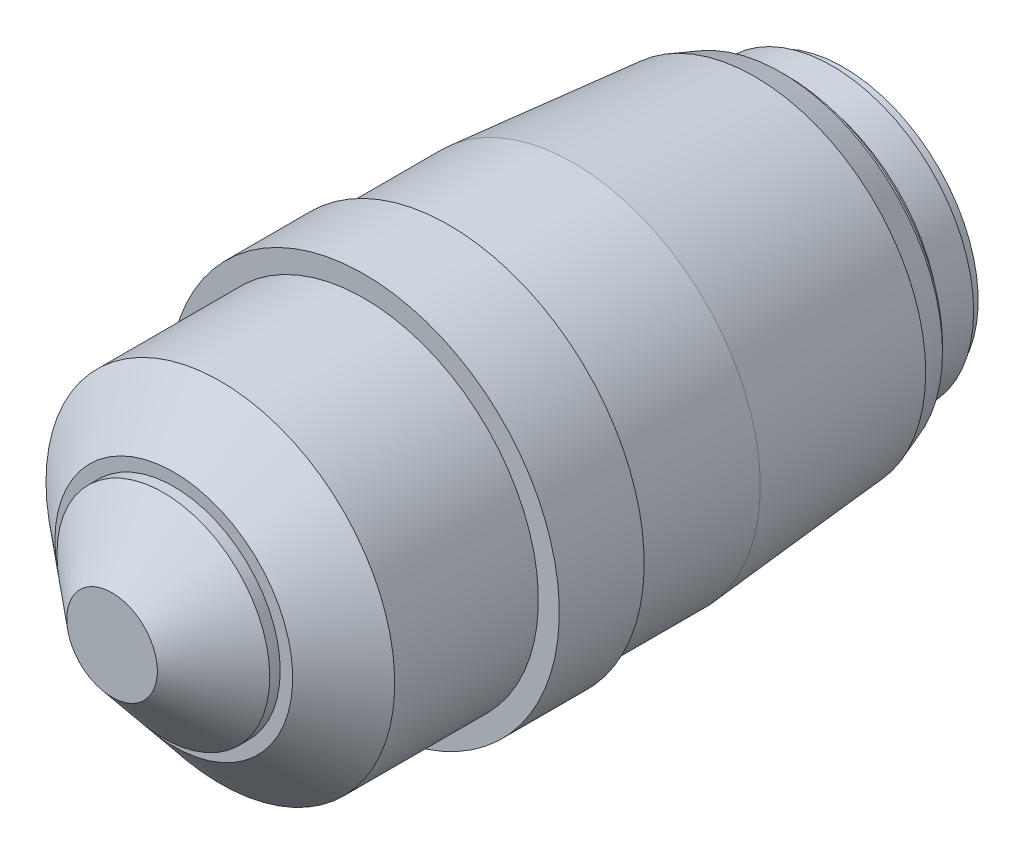
ISO-10303-21;
HEADER;
FILE_DESCRIPTION(('STEP AP214'),'2;1');
FILE_NAME('part.step','',(''),(''),'','','');
FILE_SCHEMA(('AUTOMOTIVE_DESIGN { 1 0 10303 214 1 1 1 1 }'));
ENDSEC;
DATA;
#1=APPLICATION_CONTEXT('core data for automotive mechanical design processes');
#2=APPLICATION_PROTOCOL_DEFINITION('international standard','automotive_design',2000,#1);
#3=PRODUCT_CONTEXT('',#1,'mechanical');
#4=PRODUCT('Part','Part','',(#3));
#5=PRODUCT_RELATED_PRODUCT_CATEGORY('part','',(#4));
#6=PRODUCT_DEFINITION_FORMATION('','',#4);
#7=PRODUCT_DEFINITION_CONTEXT('part definition',#1,'design');
#8=PRODUCT_DEFINITION('design','',#6,#7);
#9=PRODUCT_DEFINITION_SHAPE('','',#8);
#10=(LENGTH_UNIT() NAMED_UNIT(*) SI_UNIT(.MILLI.,.METRE.));
#11=(NAMED_UNIT(*) PLANE_ANGLE_UNIT() SI_UNIT($,.RADIAN.));
#12=(NAMED_UNIT(*) SI_UNIT($,.STERADIAN.) SOLID_ANGLE_UNIT());
#13=UNCERTAINTY_MEASURE_WITH_UNIT(LENGTH_MEASURE(1.E-05),#10,'distance_accuracy_value','');
#14=(GEOMETRIC_REPRESENTATION_CONTEXT(3) GLOBAL_UNCERTAINTY_ASSIGNED_CONTEXT((#13)) GLOBAL_UNIT_ASSIGNED_CONTEXT((#10,
#11,#12)) REPRESENTATION_CONTEXT('',''));
#15=CARTESIAN_POINT('',(0.,0.,0.));
#16=DIRECTION('',(0.,0.,1.));
#17=DIRECTION('',(1.,0.,0.));
#18=AXIS2_PLACEMENT_3D('',#15,#16,#17);
#19=CARTESIAN_POINT('',(0.,0.,-0.38));
#20=DIRECTION('',(0.,0.,-1.));
#21=DIRECTION('',(-1.,0.,0.));
#22=AXIS2_PLACEMENT_3D('',#19,#20,#21);
#23=PLANE('',#22);
#24=CARTESIAN_POINT('',(0.,0.,-0.380000000000005));
#25=DIRECTION('',(0.,0.,-1.));
#26=DIRECTION('',(-1.,0.,0.));
#27=AXIS2_PLACEMENT_3D('',#24,#25,#26);
#28=CIRCLE('',#27,4.);
#29=CARTESIAN_POINT('',(-4.,0.,-0.380000000000005));
#30=VERTEX_POINT('',#29);
#31=EDGE_CURVE('E10',#30,#30,#28,.T.);
#32=ORIENTED_EDGE('',*,*,#31,.F.);
#33=EDGE_LOOP('',(#32));
#34=FACE_BOUND('',#33,.T.);
#35=ADVANCED_FACE('F31',(#34),#23,.F.);
#36=CARTESIAN_POINT('',(0.,0.,-0.380000000000005));
#37=DIRECTION('',(0.,0.,-1.));
#38=DIRECTION('',(-1.,0.,0.));
#39=AXIS2_PLACEMENT_3D('',#36,#37,#38);
#40=CONICAL_SURFACE('',#39,4.,0.872664625997163);
#41=CARTESIAN_POINT('',(0.,0.,-4.91113800835733));
#42=DIRECTION('',(0.,0.,-1.));
#43=DIRECTION('',(-1.,0.,0.));
#44=AXIS2_PLACEMENT_3D('',#41,#42,#43);
#45=CIRCLE('',#44,9.4);
#46=CARTESIAN_POINT('',(-9.4,0.,-4.91113800835733));
#47=VERTEX_POINT('',#46);
#48=EDGE_CURVE('E37',#47,#47,#45,.T.);
#49=ORIENTED_EDGE('',*,*,#48,.F.);
#50=EDGE_LOOP('',(#49));
#51=FACE_BOUND('',#50,.T.);
#52=ORIENTED_EDGE('',*,*,#31,.T.);
#53=EDGE_LOOP('',(#52));
#54=FACE_BOUND('',#53,.T.);
#55=ADVANCED_FACE('F223',(#51,#54),#40,.T.);
#56=CARTESIAN_POINT('',(0.,0.,-64.98));
#57=DIRECTION('',(0.,0.,-1.));
#58=DIRECTION('',(-1.,0.,0.));
#59=AXIS2_PLACEMENT_3D('',#56,#57,#58);
#60=CYLINDRICAL_SURFACE('',#59,9.4);
#61=CARTESIAN_POINT('',(0.,0.,-5.83414760265234));
#62=DIRECTION('',(0.,0.,-1.));
#63=DIRECTION('',(-1.,0.,0.));
#64=AXIS2_PLACEMENT_3D('',#61,#62,#63);
#65=CIRCLE('',#64,9.4);
#66=CARTESIAN_POINT('',(-9.4,0.,-5.83414760265234));
#67=VERTEX_POINT('',#66);
#68=EDGE_CURVE('E41',#67,#67,#65,.T.);
#69=ORIENTED_EDGE('',*,*,#68,.F.);
#70=EDGE_LOOP('',(#69));
#71=FACE_BOUND('',#70,.T.);
#72=ORIENTED_EDGE('',*,*,#48,.T.);
#73=EDGE_LOOP('',(#72));
#74=FACE_BOUND('',#73,.T.);
#75=ADVANCED_FACE('F218',(#71,#74),#60,.T.);
#76=CARTESIAN_POINT('',(9.4,0.,-5.83414760265235));
#77=DIRECTION('',(0.,0.,-1.));
#78=DIRECTION('',(-1.,0.,0.));
#79=AXIS2_PLACEMENT_3D('',#76,#77,#78);
#80=PLANE('',#79);
#81=CARTESIAN_POINT('',(0.,0.,-5.83414760265234));
#82=DIRECTION('',(0.,0.,-1.));
#83=DIRECTION('',(-1.,0.,0.));
#84=AXIS2_PLACEMENT_3D('',#81,#82,#83);
#85=CIRCLE('',#84,10.5);
#86=CARTESIAN_POINT('',(-10.5,0.,-5.83414760265234));
#87=VERTEX_POINT('',#86);
#88=EDGE_CURVE('E45',#87,#87,#85,.T.);
#89=ORIENTED_EDGE('',*,*,#88,.F.);
#90=EDGE_LOOP('',(#89));
#91=FACE_BOUND('',#90,.T.);
#92=ORIENTED_EDGE('',*,*,#68,.T.);
#93=EDGE_LOOP('',(#92));
#94=FACE_BOUND('',#93,.T.);
#95=ADVANCED_FACE('F212',(#91,#94),#80,.F.);
#96=CARTESIAN_POINT('',(0.,0.,-5.83414760265234));
#97=DIRECTION('',(0.,0.,-1.));
#98=DIRECTION('',(-1.,0.,0.));
#99=AXIS2_PLACEMENT_3D('',#96,#97,#98);
#100=CONICAL_SURFACE('',#99,10.5,0.872664625997163);
#101=CARTESIAN_POINT('',(0.,0.,-9.94573579542103));
#102=DIRECTION('',(0.,0.,-1.));
#103=DIRECTION('',(-1.,0.,0.));
#104=AXIS2_PLACEMENT_3D('',#101,#102,#103);
#105=CIRCLE('',#104,15.4);
#106=CARTESIAN_POINT('',(-15.4,0.,-9.94573579542103));
#107=VERTEX_POINT('',#106);
#108=EDGE_CURVE('E50',#107,#107,#105,.T.);
#109=ORIENTED_EDGE('',*,*,#108,.F.);
#110=EDGE_LOOP('',(#109));
#111=FACE_BOUND('',#110,.T.);
#112=ORIENTED_EDGE('',*,*,#88,.T.);
#113=EDGE_LOOP('',(#112));
#114=FACE_BOUND('',#113,.T.);
#115=ADVANCED_FACE('F206',(#111,#114),#100,.T.);
#116=CARTESIAN_POINT('',(0.,0.,-64.98));
#117=DIRECTION('',(0.,0.,-1.));
#118=DIRECTION('',(-1.,0.,0.));
#119=AXIS2_PLACEMENT_3D('',#116,#117,#118);
#120=CYLINDRICAL_SURFACE('',#119,15.4);
#121=CARTESIAN_POINT('',(0.,0.,-22.6341476026524));
#122=DIRECTION('',(0.,0.,-1.));
#123=DIRECTION('',(-1.,0.,0.));
#124=AXIS2_PLACEMENT_3D('',#121,#122,#123);
#125=CIRCLE('',#124,15.4);
#126=CARTESIAN_POINT('',(-15.4,0.,-22.6341476026524));
#127=VERTEX_POINT('',#126);
#128=EDGE_CURVE('E53',#127,#127,#125,.T.);
#129=ORIENTED_EDGE('',*,*,#128,.F.);
#130=EDGE_LOOP('',(#129));
#131=FACE_BOUND('',#130,.T.);
#132=ORIENTED_EDGE('',*,*,#108,.T.);
#133=EDGE_LOOP('',(#132));
#134=FACE_BOUND('',#133,.T.);
#135=ADVANCED_FACE('F200',(#131,#134),#120,.T.);
#136=CARTESIAN_POINT('',(15.4,0.,-22.6341476026523));
#137=DIRECTION('',(0.,0.,-1.));
#138=DIRECTION('',(-1.,0.,0.));
#139=AXIS2_PLACEMENT_3D('',#136,#137,#138);
#140=PLANE('',#139);
#141=CARTESIAN_POINT('',(0.,0.,-22.6341476026523));
#142=DIRECTION('',(0.,0.,-1.));
#143=DIRECTION('',(-1.,0.,0.));
#144=AXIS2_PLACEMENT_3D('',#141,#142,#143);
#145=CIRCLE('',#144,17.25);
#146=CARTESIAN_POINT('',(-17.25,0.,-22.6341476026523));
#147=VERTEX_POINT('',#146);
#148=EDGE_CURVE('E56',#147,#147,#145,.T.);
#149=ORIENTED_EDGE('',*,*,#148,.F.);
#150=EDGE_LOOP('',(#149));
#151=FACE_BOUND('',#150,.T.);
#152=ORIENTED_EDGE('',*,*,#128,.T.);
#153=EDGE_LOOP('',(#152));
#154=FACE_BOUND('',#153,.T.);
#155=ADVANCED_FACE('F194',(#151,#154),#140,.F.);
#156=CARTESIAN_POINT('',(0.,0.,-64.98));
#157=DIRECTION('',(0.,0.,-1.));
#158=DIRECTION('',(-1.,0.,0.));
#159=AXIS2_PLACEMENT_3D('',#156,#157,#158);
#160=CYLINDRICAL_SURFACE('',#159,17.25);
#161=CARTESIAN_POINT('',(0.,0.,-30.1341476026523));
#162=DIRECTION('',(0.,0.,-1.));
#163=DIRECTION('',(-1.,0.,0.));
#164=AXIS2_PLACEMENT_3D('',#161,#162,#163);
#165=CIRCLE('',#164,17.25);
#166=CARTESIAN_POINT('',(-17.25,0.,-30.1341476026523));
#167=VERTEX_POINT('',#166);
#168=EDGE_CURVE('E59',#167,#167,#165,.T.);
#169=ORIENTED_EDGE('',*,*,#168,.F.);
#170=EDGE_LOOP('',(#169));
#171=FACE_BOUND('',#170,.T.);
#172=ORIENTED_EDGE('',*,*,#148,.T.);
#173=EDGE_LOOP('',(#172));
#174=FACE_BOUND('',#173,.T.);
#175=ADVANCED_FACE('F188',(#171,#174),#160,.T.);
#176=CARTESIAN_POINT('',(17.25,0.,-30.1341476026523));
#177=DIRECTION('',(0.,0.,1.));
#178=DIRECTION('',(1.,0.,0.));
#179=AXIS2_PLACEMENT_3D('',#176,#177,#178);
#180=PLANE('',#179);
#181=CARTESIAN_POINT('',(0.,0.,-30.1341476026523));
#182=DIRECTION('',(0.,0.,-1.));
#183=DIRECTION('',(-1.,0.,0.));
#184=AXIS2_PLACEMENT_3D('',#181,#182,#183);
#185=CIRCLE('',#184,16.5);
#186=CARTESIAN_POINT('',(-16.5,0.,-30.1341476026523));
#187=VERTEX_POINT('',#186);
#188=EDGE_CURVE('E62',#187,#187,#185,.T.);
#189=ORIENTED_EDGE('',*,*,#188,.F.);
#190=EDGE_LOOP('',(#189));
#191=FACE_BOUND('',#190,.T.);
#192=ORIENTED_EDGE('',*,*,#168,.T.);
#193=EDGE_LOOP('',(#192));
#194=FACE_BOUND('',#193,.T.);
#195=ADVANCED_FACE('F182',(#191,#194),#180,.F.);
#196=CARTESIAN_POINT('',(0.,0.,-64.98));
#197=DIRECTION('',(0.,0.,-1.));
#198=DIRECTION('',(-1.,0.,0.));
#199=AXIS2_PLACEMENT_3D('',#196,#197,#198);
#200=CYLINDRICAL_SURFACE('',#199,16.5);
#201=CARTESIAN_POINT('',(0.,0.,-41.1341476026523));
#202=DIRECTION('',(0.,0.,-1.));
#203=DIRECTION('',(-1.,0.,0.));
#204=AXIS2_PLACEMENT_3D('',#201,#202,#203);
#205=CIRCLE('',#204,16.5);
#206=CARTESIAN_POINT('',(-16.5,0.,-41.1341476026523));
#207=VERTEX_POINT('',#206);
#208=EDGE_CURVE('E65',#207,#207,#205,.T.);
#209=ORIENTED_EDGE('',*,*,#208,.F.);
#210=EDGE_LOOP('',(#209));
#211=FACE_BOUND('',#210,.T.);
#212=ORIENTED_EDGE('',*,*,#188,.T.);
#213=EDGE_LOOP('',(#212));
#214=FACE_BOUND('',#213,.T.);
#215=ADVANCED_FACE('F176',(#211,#214),#200,.T.);
#216=CARTESIAN_POINT('',(0.,0.,-41.1341476026523));
#217=DIRECTION('',(0.,0.,1.));
#218=DIRECTION('',(1.,0.,0.));
#219=AXIS2_PLACEMENT_3D('',#216,#217,#218);
#220=CONICAL_SURFACE('',#219,16.5,0.0872664625997166);
#221=CARTESIAN_POINT('',(0.,0.,-57.1473096482151));
#222=DIRECTION('',(0.,0.,-1.));
#223=DIRECTION('',(-1.,0.,0.));
#224=AXIS2_PLACEMENT_3D('',#221,#222,#223);
#225=CIRCLE('',#224,15.0990298538097);
#226=CARTESIAN_POINT('',(-15.0990298538097,0.,-57.1473096482151));
#227=VERTEX_POINT('',#226);
#228=EDGE_CURVE('E68',#227,#227,#225,.T.);
#229=ORIENTED_EDGE('',*,*,#228,.F.);
#230=EDGE_LOOP('',(#229));
#231=FACE_BOUND('',#230,.T.);
#232=ORIENTED_EDGE('',*,*,#208,.T.);
#233=EDGE_LOOP('',(#232));
#234=FACE_BOUND('',#233,.T.);
#235=ADVANCED_FACE('F170',(#231,#234),#220,.T.);
#236=CARTESIAN_POINT('',(0.,0.,-57.1473096482151));
#237=DIRECTION('',(0.,0.,1.));
#238=DIRECTION('',(1.,0.,0.));
#239=AXIS2_PLACEMENT_3D('',#236,#237,#238);
#240=CONICAL_SURFACE('',#239,15.0990298538097,0.349065850398863);
#241=CARTESIAN_POINT('',(0.,0.,-59.48));
#242=DIRECTION('',(0.,0.,-1.));
#243=DIRECTION('',(-1.,0.,0.));
#244=AXIS2_PLACEMENT_3D('',#241,#242,#243);
#245=CIRCLE('',#244,14.25);
#246=CARTESIAN_POINT('',(-14.25,0.,-59.48));
#247=VERTEX_POINT('',#246);
#248=EDGE_CURVE('E71',#247,#247,#245,.T.);
#249=ORIENTED_EDGE('',*,*,#248,.F.);
#250=EDGE_LOOP('',(#249));
#251=FACE_BOUND('',#250,.T.);
#252=ORIENTED_EDGE('',*,*,#228,.T.);
#253=EDGE_LOOP('',(#252));
#254=FACE_BOUND('',#253,.T.);
#255=ADVANCED_FACE('F164',(#251,#254),#240,.T.);
#256=CARTESIAN_POINT('',(14.25,0.,-59.48));
#257=DIRECTION('',(0.,0.,1.));
#258=DIRECTION('',(1.,0.,0.));
#259=AXIS2_PLACEMENT_3D('',#256,#257,#258);
#260=PLANE('',#259);
#261=CARTESIAN_POINT('',(0.,0.,-59.48));
#262=DIRECTION('',(0.,0.,-1.));
#263=DIRECTION('',(-1.,0.,0.));
#264=AXIS2_PLACEMENT_3D('',#261,#262,#263);
#265=CIRCLE('',#264,13.75);
#266=CARTESIAN_POINT('',(-13.75,0.,-59.48));
#267=VERTEX_POINT('',#266);
#268=EDGE_CURVE('E74',#267,#267,#265,.T.);
#269=ORIENTED_EDGE('',*,*,#268,.F.);
#270=EDGE_LOOP('',(#269));
#271=FACE_BOUND('',#270,.T.);
#272=ORIENTED_EDGE('',*,*,#248,.T.);
#273=EDGE_LOOP('',(#272));
#274=FACE_BOUND('',#273,.T.);
#275=ADVANCED_FACE('F158',(#271,#274),#260,.F.);
#276=CARTESIAN_POINT('',(0.,0.,-64.98));
#277=DIRECTION('',(0.,0.,-1.));
#278=DIRECTION('',(-1.,0.,0.));
#279=AXIS2_PLACEMENT_3D('',#276,#277,#278);
#280=CYLINDRICAL_SURFACE('',#279,13.75);
#281=CARTESIAN_POINT('',(0.,0.,-59.98));
#282=DIRECTION('',(0.,0.,-1.));
#283=DIRECTION('',(-1.,0.,0.));
#284=AXIS2_PLACEMENT_3D('',#281,#282,#283);
#285=CIRCLE('',#284,13.75);
#286=CARTESIAN_POINT('',(-13.75,0.,-59.98));
#287=VERTEX_POINT('',#286);
#288=EDGE_CURVE('E77',#287,#287,#285,.T.);
#289=ORIENTED_EDGE('',*,*,#288,.F.);
#290=EDGE_LOOP('',(#289));
#291=FACE_BOUND('',#290,.T.);
#292=ORIENTED_EDGE('',*,*,#268,.T.);
#293=EDGE_LOOP('',(#292));
#294=FACE_BOUND('',#293,.T.);
#295=ADVANCED_FACE('F152',(#291,#294),#280,.T.);
#296=CARTESIAN_POINT('',(13.75,0.,-59.98));
#297=DIRECTION('',(0.,0.,1.));
#298=DIRECTION('',(1.,0.,0.));
#299=AXIS2_PLACEMENT_3D('',#296,#297,#298);
#300=PLANE('',#299);
#301=CARTESIAN_POINT('',(0.,0.,-59.98));
#302=DIRECTION('',(0.,0.,-1.));
#303=DIRECTION('',(-1.,0.,0.));
#304=AXIS2_PLACEMENT_3D('',#301,#302,#303);
#305=CIRCLE('',#304,11.9);
#306=CARTESIAN_POINT('',(-11.9,0.,-59.98));
#307=VERTEX_POINT('',#306);
#308=EDGE_CURVE('E80',#307,#307,#305,.T.);
#309=ORIENTED_EDGE('',*,*,#308,.F.);
#310=EDGE_LOOP('',(#309));
#311=FACE_BOUND('',#310,.T.);
#312=ORIENTED_EDGE('',*,*,#288,.T.);
#313=EDGE_LOOP('',(#312));
#314=FACE_BOUND('',#313,.T.);
#315=ADVANCED_FACE('F146',(#311,#314),#300,.F.);
#316=CARTESIAN_POINT('',(0.,0.,-64.98));
#317=DIRECTION('',(0.,0.,-1.));
#318=DIRECTION('',(-1.,0.,0.));
#319=AXIS2_PLACEMENT_3D('',#316,#317,#318);
#320=CYLINDRICAL_SURFACE('',#319,11.9);
#321=CARTESIAN_POINT('',(0.,0.,-60.98));
#322=DIRECTION('',(0.,0.,-1.));
#323=DIRECTION('',(-1.,0.,0.));
#324=AXIS2_PLACEMENT_3D('',#321,#322,#323);
#325=CIRCLE('',#324,11.9);
#326=CARTESIAN_POINT('',(-11.9,0.,-60.98));
#327=VERTEX_POINT('',#326);
#328=EDGE_CURVE('E83',#327,#327,#325,.T.);
#329=ORIENTED_EDGE('',*,*,#328,.F.);
#330=EDGE_LOOP('',(#329));
#331=FACE_BOUND('',#330,.T.);
#332=ORIENTED_EDGE('',*,*,#308,.T.);
#333=EDGE_LOOP('',(#332));
#334=FACE_BOUND('',#333,.T.);
#335=ADVANCED_FACE('F140',(#331,#334),#320,.T.);
#336=CARTESIAN_POINT('',(11.9,0.,-60.98));
#337=DIRECTION('',(0.,0.,-1.));
#338=DIRECTION('',(-1.,0.,0.));
#339=AXIS2_PLACEMENT_3D('',#336,#337,#338);
#340=PLANE('',#339);
#341=CARTESIAN_POINT('',(0.,0.,-60.98));
#342=DIRECTION('',(0.,0.,-1.));
#343=DIRECTION('',(-1.,0.,0.));
#344=AXIS2_PLACEMENT_3D('',#341,#342,#343);
#345=CIRCLE('',#344,12.5);
#346=CARTESIAN_POINT('',(-12.5,0.,-60.98));
#347=VERTEX_POINT('',#346);
#348=EDGE_CURVE('E86',#347,#347,#345,.T.);
#349=ORIENTED_EDGE('',*,*,#348,.F.);
#350=EDGE_LOOP('',(#349));
#351=FACE_BOUND('',#350,.T.);
#352=ORIENTED_EDGE('',*,*,#328,.T.);
#353=EDGE_LOOP('',(#352));
#354=FACE_BOUND('',#353,.T.);
#355=ADVANCED_FACE('F134',(#351,#354),#340,.F.);
#356=CARTESIAN_POINT('',(0.,0.,-64.98));
#357=DIRECTION('',(0.,0.,-1.));
#358=DIRECTION('',(-1.,0.,0.));
#359=AXIS2_PLACEMENT_3D('',#356,#357,#358);
#360=CYLINDRICAL_SURFACE('',#359,12.5);
#361=CARTESIAN_POINT('',(0.,0.,-63.98));
#362=DIRECTION('',(0.,0.,-1.));
#363=DIRECTION('',(-1.,0.,0.));
#364=AXIS2_PLACEMENT_3D('',#361,#362,#363);
#365=CIRCLE('',#364,12.5);
#366=CARTESIAN_POINT('',(-12.5,0.,-63.98));
#367=VERTEX_POINT('',#366);
#368=EDGE_CURVE('E89',#367,#367,#365,.T.);
#369=ORIENTED_EDGE('',*,*,#368,.F.);
#370=EDGE_LOOP('',(#369));
#371=FACE_BOUND('',#370,.T.);
#372=ORIENTED_EDGE('',*,*,#348,.T.);
#373=EDGE_LOOP('',(#372));
#374=FACE_BOUND('',#373,.T.);
#375=ADVANCED_FACE('F128',(#371,#374),#360,.T.);
#376=CARTESIAN_POINT('',(12.5,0.,-63.98));
#377=DIRECTION('',(0.,0.,1.));
#378=DIRECTION('',(1.,0.,0.));
#379=AXIS2_PLACEMENT_3D('',#376,#377,#378);
#380=PLANE('',#379);
#381=CARTESIAN_POINT('',(0.,0.,-63.98));
#382=DIRECTION('',(0.,0.,-1.));
#383=DIRECTION('',(-1.,0.,0.));
#384=AXIS2_PLACEMENT_3D('',#381,#382,#383);
#385=CIRCLE('',#384,11.9);
#386=CARTESIAN_POINT('',(-11.9,0.,-63.98));
#387=VERTEX_POINT('',#386);
#388=EDGE_CURVE('E92',#387,#387,#385,.T.);
#389=ORIENTED_EDGE('',*,*,#388,.F.);
#390=EDGE_LOOP('',(#389));
#391=FACE_BOUND('',#390,.T.);
#392=ORIENTED_EDGE('',*,*,#368,.T.);
#393=EDGE_LOOP('',(#392));
#394=FACE_BOUND('',#393,.T.);
#395=ADVANCED_FACE('F122',(#391,#394),#380,.F.);
#396=CARTESIAN_POINT('',(0.,0.,-64.98));
#397=DIRECTION('',(0.,0.,-1.));
#398=DIRECTION('',(-1.,0.,0.));
#399=AXIS2_PLACEMENT_3D('',#396,#397,#398);
#400=CYLINDRICAL_SURFACE('',#399,11.9);
#401=CARTESIAN_POINT('',(0.,0.,-64.98));
#402=DIRECTION('',(0.,0.,-1.));
#403=DIRECTION('',(-1.,0.,0.));
#404=AXIS2_PLACEMENT_3D('',#401,#402,#403);
#405=CIRCLE('',#404,11.9);
#406=CARTESIAN_POINT('',(-11.9,0.,-64.98));
#407=VERTEX_POINT('',#406);
#408=EDGE_CURVE('E95',#407,#407,#405,.T.);
#409=ORIENTED_EDGE('',*,*,#408,.F.);
#410=EDGE_LOOP('',(#409));
#411=FACE_BOUND('',#410,.T.);
#412=ORIENTED_EDGE('',*,*,#388,.T.);
#413=EDGE_LOOP('',(#412));
#414=FACE_BOUND('',#413,.T.);
#415=ADVANCED_FACE('F116',(#411,#414),#400,.T.);
#416=CARTESIAN_POINT('',(11.9,0.,-64.98));
#417=DIRECTION('',(0.,0.,1.));
#418=DIRECTION('',(1.,0.,0.));
#419=AXIS2_PLACEMENT_3D('',#416,#417,#418);
#420=PLANE('',#419);
#421=CARTESIAN_POINT('',(0.,0.,-64.98));
#422=DIRECTION('',(0.,0.,-1.));
#423=DIRECTION('',(-1.,0.,0.));
#424=AXIS2_PLACEMENT_3D('',#421,#422,#423);
#425=CIRCLE('',#424,4.75);
#426=CARTESIAN_POINT('',(-4.75,0.,-64.98));
#427=VERTEX_POINT('',#426);
#428=EDGE_CURVE('E99',#427,#427,#425,.T.);
#429=ORIENTED_EDGE('',*,*,#428,.F.);
#430=EDGE_LOOP('',(#429));
#431=FACE_BOUND('',#430,.T.);
#432=ORIENTED_EDGE('',*,*,#408,.T.);
#433=EDGE_LOOP('',(#432));
#434=FACE_BOUND('',#433,.T.);
#435=ADVANCED_FACE('F110',(#431,#434),#420,.F.);
#436=CARTESIAN_POINT('',(0.,0.,-63.98));
#437=DIRECTION('',(0.,0.,-1.));
#438=DIRECTION('',(-1.,0.,0.));
#439=AXIS2_PLACEMENT_3D('',#436,#437,#438);
#440=CYLINDRICAL_SURFACE('',#439,4.75);
#441=CARTESIAN_POINT('',(0.,0.,-63.98));
#442=DIRECTION('',(0.,0.,-1.));
#443=DIRECTION('',(-1.,0.,0.));
#444=AXIS2_PLACEMENT_3D('',#441,#442,#443);
#445=CIRCLE('',#444,4.75);
#446=CARTESIAN_POINT('',(-4.75,0.,-63.98));
#447=VERTEX_POINT('',#446);
#448=EDGE_CURVE('E98',#447,#447,#445,.T.);
#449=ORIENTED_EDGE('',*,*,#448,.F.);
#450=EDGE_LOOP('',(#449));
#451=FACE_BOUND('',#450,.T.);
#452=ORIENTED_EDGE('',*,*,#428,.T.);
#453=EDGE_LOOP('',(#452));
#454=FACE_BOUND('',#453,.T.);
#455=ADVANCED_FACE('F107',(#451,#454),#440,.F.);
#456=CARTESIAN_POINT('',(0.,0.,-63.98));
#457=DIRECTION('',(0.,0.,-1.));
#458=DIRECTION('',(-1.,0.,0.));
#459=AXIS2_PLACEMENT_3D('',#456,#457,#458);
#460=PLANE('',#459);
#461=ORIENTED_EDGE('',*,*,#448,.T.);
#462=EDGE_LOOP('',(#461));
#463=FACE_BOUND('',#462,.T.);
#464=ADVANCED_FACE('F105',(#463),#460,.T.);
#465=CLOSED_SHELL('',(#35,#55,#75,#95,#115,#135,#155,#175,#195,#215,#235,#255,#275,#295,#315,
#335,#355,#375,#395,#415,#435,#455,#464));
#466=MANIFOLD_SOLID_BREP('B2',#465);
#467=ADVANCED_BREP_SHAPE_REPRESENTATION('',(#18,#466),#14);
#468=SHAPE_DEFINITION_REPRESENTATION(#9,#467);
ENDSEC;
END-ISO-10303-21;
